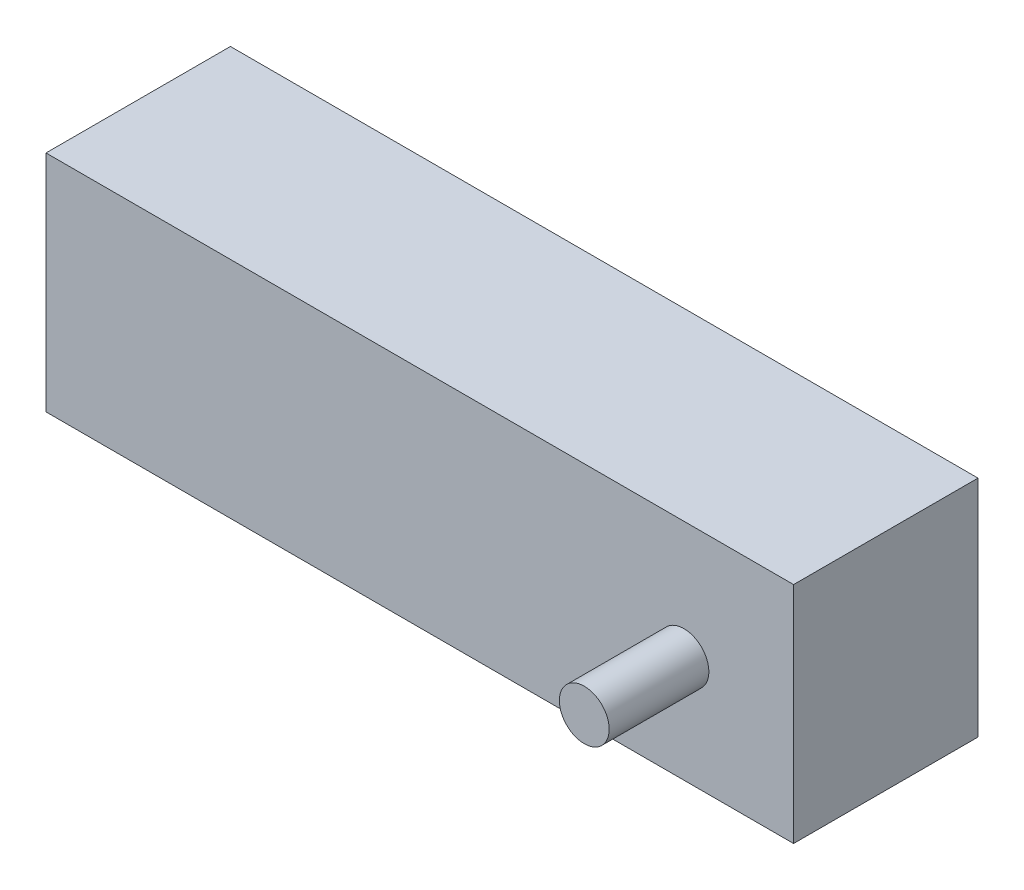
ISO-10303-21;
HEADER;
FILE_DESCRIPTION(('STEP AP214'),'2;1');
FILE_NAME('part.step','',(''),(''),'','','');
FILE_SCHEMA(('AUTOMOTIVE_DESIGN { 1 0 10303 214 1 1 1 1 }'));
ENDSEC;
DATA;
#1=APPLICATION_CONTEXT('core data for automotive mechanical design processes');
#2=APPLICATION_PROTOCOL_DEFINITION('international standard','automotive_design',2000,#1);
#3=PRODUCT_CONTEXT('',#1,'mechanical');
#4=PRODUCT('Part','Part','',(#3));
#5=PRODUCT_RELATED_PRODUCT_CATEGORY('part','',(#4));
#6=PRODUCT_DEFINITION_FORMATION('','',#4);
#7=PRODUCT_DEFINITION_CONTEXT('part definition',#1,'design');
#8=PRODUCT_DEFINITION('design','',#6,#7);
#9=PRODUCT_DEFINITION_SHAPE('','',#8);
#10=(LENGTH_UNIT() NAMED_UNIT(*) SI_UNIT(.MILLI.,.METRE.));
#11=(NAMED_UNIT(*) PLANE_ANGLE_UNIT() SI_UNIT($,.RADIAN.));
#12=(NAMED_UNIT(*) SI_UNIT($,.STERADIAN.) SOLID_ANGLE_UNIT());
#13=UNCERTAINTY_MEASURE_WITH_UNIT(LENGTH_MEASURE(1.E-05),#10,'distance_accuracy_value','');
#14=(GEOMETRIC_REPRESENTATION_CONTEXT(3) GLOBAL_UNCERTAINTY_ASSIGNED_CONTEXT((#13)) GLOBAL_UNIT_ASSIGNED_CONTEXT((#10,
#11,#12)) REPRESENTATION_CONTEXT('',''));
#15=CARTESIAN_POINT('',(0.,0.,0.));
#16=DIRECTION('',(0.,0.,1.));
#17=DIRECTION('',(1.,0.,0.));
#18=AXIS2_PLACEMENT_3D('',#15,#16,#17);
#19=CARTESIAN_POINT('',(2.5,-13.1095041322314,18.5));
#20=DIRECTION('',(1.,0.,0.));
#21=DIRECTION('',(0.,0.,-1.));
#22=AXIS2_PLACEMENT_3D('',#19,#20,#21);
#23=PLANE('',#22);
#24=DIRECTION('',(0.,-1.,0.));
#25=VECTOR('',#24,1.);
#26=CARTESIAN_POINT('',(2.5,-13.1095041322314,0.));
#27=LINE('',#26,#25);
#28=CARTESIAN_POINT('',(2.5,9.39049586776859,0.));
#29=VERTEX_POINT('',#28);
#30=CARTESIAN_POINT('',(2.5,-13.1095041322314,0.));
#31=VERTEX_POINT('',#30);
#32=EDGE_CURVE('E99',#29,#31,#27,.T.);
#33=ORIENTED_EDGE('',*,*,#32,.T.);
#34=DIRECTION('',(0.,0.,-1.));
#35=VECTOR('',#34,1.);
#36=CARTESIAN_POINT('',(2.5,-13.1095041322314,18.5));
#37=LINE('',#36,#35);
#38=CARTESIAN_POINT('',(2.5,-13.1095041322314,18.5));
#39=VERTEX_POINT('',#38);
#40=EDGE_CURVE('E41',#39,#31,#37,.T.);
#41=ORIENTED_EDGE('',*,*,#40,.F.);
#42=DIRECTION('',(0.,-1.,0.));
#43=VECTOR('',#42,1.);
#44=CARTESIAN_POINT('',(2.5,-13.1095041322314,18.5));
#45=LINE('',#44,#43);
#46=CARTESIAN_POINT('',(2.5,9.39049586776859,18.5));
#47=VERTEX_POINT('',#46);
#48=EDGE_CURVE('E85',#47,#39,#45,.T.);
#49=ORIENTED_EDGE('',*,*,#48,.F.);
#50=DIRECTION('',(0.,0.,-1.));
#51=VECTOR('',#50,1.);
#52=CARTESIAN_POINT('',(2.5,9.39049586776859,18.5));
#53=LINE('',#52,#51);
#54=EDGE_CURVE('E95',#47,#29,#53,.T.);
#55=ORIENTED_EDGE('',*,*,#54,.T.);
#56=EDGE_LOOP('',(#33,#41,#49,#55));
#57=FACE_BOUND('',#56,.T.);
#58=ADVANCED_FACE('F33',(#57),#23,.F.);
#59=CARTESIAN_POINT('',(2.5,-13.1095041322314,18.5));
#60=DIRECTION('',(0.,1.,0.));
#61=DIRECTION('',(-1.,0.,0.));
#62=AXIS2_PLACEMENT_3D('',#59,#60,#61);
#63=PLANE('',#62);
#64=DIRECTION('',(1.,0.,0.));
#65=VECTOR('',#64,1.);
#66=CARTESIAN_POINT('',(2.5,-13.1095041322314,0.));
#67=LINE('',#66,#65);
#68=CARTESIAN_POINT('',(77.5,-13.1095041322314,0.));
#69=VERTEX_POINT('',#68);
#70=EDGE_CURVE('E90',#31,#69,#67,.T.);
#71=ORIENTED_EDGE('',*,*,#70,.T.);
#72=DIRECTION('',(0.,0.,-1.));
#73=VECTOR('',#72,1.);
#74=CARTESIAN_POINT('',(77.5,-13.1095041322314,18.5));
#75=LINE('',#74,#73);
#76=CARTESIAN_POINT('',(77.5,-13.1095041322314,18.5));
#77=VERTEX_POINT('',#76);
#78=EDGE_CURVE('E88',#77,#69,#75,.T.);
#79=ORIENTED_EDGE('',*,*,#78,.F.);
#80=DIRECTION('',(1.,0.,0.));
#81=VECTOR('',#80,1.);
#82=CARTESIAN_POINT('',(2.5,-13.1095041322314,18.5));
#83=LINE('',#82,#81);
#84=EDGE_CURVE('E80',#39,#77,#83,.T.);
#85=ORIENTED_EDGE('',*,*,#84,.F.);
#86=ORIENTED_EDGE('',*,*,#40,.T.);
#87=EDGE_LOOP('',(#71,#79,#85,#86));
#88=FACE_BOUND('',#87,.T.);
#89=ADVANCED_FACE('F89',(#88),#63,.F.);
#90=CARTESIAN_POINT('',(77.5,-13.1095041322314,18.5));
#91=DIRECTION('',(-1.,0.,0.));
#92=DIRECTION('',(0.,0.,1.));
#93=AXIS2_PLACEMENT_3D('',#90,#91,#92);
#94=PLANE('',#93);
#95=DIRECTION('',(0.,1.,0.));
#96=VECTOR('',#95,1.);
#97=CARTESIAN_POINT('',(77.5,-13.1095041322314,0.));
#98=LINE('',#97,#96);
#99=CARTESIAN_POINT('',(77.5,9.3904958677686,0.));
#100=VERTEX_POINT('',#99);
#101=EDGE_CURVE('E66',#69,#100,#98,.T.);
#102=ORIENTED_EDGE('',*,*,#101,.T.);
#103=DIRECTION('',(0.,0.,-1.));
#104=VECTOR('',#103,1.);
#105=CARTESIAN_POINT('',(77.5,9.3904958677686,18.5));
#106=LINE('',#105,#104);
#107=CARTESIAN_POINT('',(77.5,9.3904958677686,18.5));
#108=VERTEX_POINT('',#107);
#109=EDGE_CURVE('E91',#108,#100,#106,.T.);
#110=ORIENTED_EDGE('',*,*,#109,.F.);
#111=DIRECTION('',(0.,1.,0.));
#112=VECTOR('',#111,1.);
#113=CARTESIAN_POINT('',(77.5,-13.1095041322314,18.5));
#114=LINE('',#113,#112);
#115=EDGE_CURVE('E83',#77,#108,#114,.T.);
#116=ORIENTED_EDGE('',*,*,#115,.F.);
#117=ORIENTED_EDGE('',*,*,#78,.T.);
#118=EDGE_LOOP('',(#102,#110,#116,#117));
#119=FACE_BOUND('',#118,.T.);
#120=ADVANCED_FACE('F93',(#119),#94,.F.);
#121=CARTESIAN_POINT('',(2.5,9.39049586776859,18.5));
#122=DIRECTION('',(0.,-1.,0.));
#123=DIRECTION('',(1.,0.,0.));
#124=AXIS2_PLACEMENT_3D('',#121,#122,#123);
#125=PLANE('',#124);
#126=DIRECTION('',(-1.,0.,0.));
#127=VECTOR('',#126,1.);
#128=CARTESIAN_POINT('',(2.5,9.39049586776859,0.));
#129=LINE('',#128,#127);
#130=EDGE_CURVE('E72',#100,#29,#129,.T.);
#131=ORIENTED_EDGE('',*,*,#130,.T.);
#132=ORIENTED_EDGE('',*,*,#54,.F.);
#133=DIRECTION('',(-1.,0.,0.));
#134=VECTOR('',#133,1.);
#135=CARTESIAN_POINT('',(2.5,9.39049586776859,18.5));
#136=LINE('',#135,#134);
#137=EDGE_CURVE('E49',#108,#47,#136,.T.);
#138=ORIENTED_EDGE('',*,*,#137,.F.);
#139=ORIENTED_EDGE('',*,*,#109,.T.);
#140=EDGE_LOOP('',(#131,#132,#138,#139));
#141=FACE_BOUND('',#140,.T.);
#142=ADVANCED_FACE('F122',(#141),#125,.F.);
#143=CARTESIAN_POINT('',(0.,0.,18.5));
#144=DIRECTION('',(0.,0.,-1.));
#145=DIRECTION('',(-1.,0.,0.));
#146=AXIS2_PLACEMENT_3D('',#143,#144,#145);
#147=PLANE('',#146);
#148=CARTESIAN_POINT('',(66.5,-2.43727261258631,18.5));
#149=DIRECTION('',(0.,0.,-1.));
#150=DIRECTION('',(-1.,0.,0.));
#151=AXIS2_PLACEMENT_3D('',#148,#149,#150);
#152=CIRCLE('',#151,2.5);
#153=CARTESIAN_POINT('',(64.,-2.43727261258631,18.5));
#154=VERTEX_POINT('',#153);
#155=EDGE_CURVE('E11',#154,#154,#152,.F.);
#156=ORIENTED_EDGE('',*,*,#155,.F.);
#157=EDGE_LOOP('',(#156));
#158=FACE_BOUND('',#157,.T.);
#159=ORIENTED_EDGE('',*,*,#48,.T.);
#160=ORIENTED_EDGE('',*,*,#84,.T.);
#161=ORIENTED_EDGE('',*,*,#115,.T.);
#162=ORIENTED_EDGE('',*,*,#137,.T.);
#163=EDGE_LOOP('',(#159,#160,#161,#162));
#164=FACE_BOUND('',#163,.T.);
#165=ADVANCED_FACE('F81',(#158,#164),#147,.F.);
#166=CARTESIAN_POINT('',(0.,0.,0.));
#167=DIRECTION('',(0.,0.,-1.));
#168=DIRECTION('',(-1.,0.,0.));
#169=AXIS2_PLACEMENT_3D('',#166,#167,#168);
#170=PLANE('',#169);
#171=CARTESIAN_POINT('',(46.,7.39049586776859,0.));
#172=DIRECTION('',(0.,0.,-1.));
#173=DIRECTION('',(-1.,0.,0.));
#174=AXIS2_PLACEMENT_3D('',#171,#172,#173);
#175=CIRCLE('',#174,1.5);
#176=CARTESIAN_POINT('',(44.5,7.39049586776859,0.));
#177=VERTEX_POINT('',#176);
#178=EDGE_CURVE('E211',#177,#177,#175,.T.);
#179=ORIENTED_EDGE('',*,*,#178,.F.);
#180=EDGE_LOOP('',(#179));
#181=FACE_BOUND('',#180,.T.);
#182=CARTESIAN_POINT('',(46.,-11.1095041322314,0.));
#183=DIRECTION('',(0.,0.,-1.));
#184=DIRECTION('',(-1.,0.,0.));
#185=AXIS2_PLACEMENT_3D('',#182,#183,#184);
#186=CIRCLE('',#185,1.5);
#187=CARTESIAN_POINT('',(44.5,-11.1095041322314,0.));
#188=VERTEX_POINT('',#187);
#189=EDGE_CURVE('E221',#188,#188,#186,.T.);
#190=ORIENTED_EDGE('',*,*,#189,.F.);
#191=EDGE_LOOP('',(#190));
#192=FACE_BOUND('',#191,.T.);
#193=ORIENTED_EDGE('',*,*,#32,.F.);
#194=ORIENTED_EDGE('',*,*,#130,.F.);
#195=ORIENTED_EDGE('',*,*,#101,.F.);
#196=ORIENTED_EDGE('',*,*,#70,.F.);
#197=EDGE_LOOP('',(#193,#194,#195,#196));
#198=FACE_BOUND('',#197,.T.);
#199=ADVANCED_FACE('F110',(#181,#192,#198),#170,.T.);
#200=CARTESIAN_POINT('',(66.5,-2.43727261258631,28.5));
#201=DIRECTION('',(0.,0.,-1.));
#202=DIRECTION('',(-1.,0.,0.));
#203=AXIS2_PLACEMENT_3D('',#200,#201,#202);
#204=CYLINDRICAL_SURFACE('',#203,2.5);
#205=CARTESIAN_POINT('',(66.5,-2.43727261258631,28.5));
#206=DIRECTION('',(0.,0.,1.));
#207=DIRECTION('',(1.,0.,0.));
#208=AXIS2_PLACEMENT_3D('',#205,#206,#207);
#209=CIRCLE('',#208,2.5);
#210=CARTESIAN_POINT('',(69.,-2.43727261258631,28.5));
#211=VERTEX_POINT('',#210);
#212=EDGE_CURVE('E102',#211,#211,#209,.T.);
#213=ORIENTED_EDGE('',*,*,#212,.F.);
#214=EDGE_LOOP('',(#213));
#215=FACE_BOUND('',#214,.T.);
#216=ORIENTED_EDGE('',*,*,#155,.T.);
#217=EDGE_LOOP('',(#216));
#218=FACE_BOUND('',#217,.T.);
#219=ADVANCED_FACE('F112',(#215,#218),#204,.T.);
#220=CARTESIAN_POINT('',(66.5,-2.43727261258631,28.5));
#221=DIRECTION('',(0.,0.,1.));
#222=DIRECTION('',(1.,0.,0.));
#223=AXIS2_PLACEMENT_3D('',#220,#221,#222);
#224=PLANE('',#223);
#225=ORIENTED_EDGE('',*,*,#212,.T.);
#226=EDGE_LOOP('',(#225));
#227=FACE_BOUND('',#226,.T.);
#228=ADVANCED_FACE('F119',(#227),#224,.T.);
#229=CARTESIAN_POINT('',(46.,-11.1095041322314,15.));
#230=DIRECTION('',(0.,0.,-1.));
#231=DIRECTION('',(-1.,0.,0.));
#232=AXIS2_PLACEMENT_3D('',#229,#230,#231);
#233=CYLINDRICAL_SURFACE('',#232,1.5);
#234=CARTESIAN_POINT('',(46.,-11.1095041322314,15.));
#235=DIRECTION('',(0.,0.,-1.));
#236=DIRECTION('',(-1.,0.,0.));
#237=AXIS2_PLACEMENT_3D('',#234,#235,#236);
#238=CIRCLE('',#237,1.5);
#239=CARTESIAN_POINT('',(44.5,-11.1095041322314,15.));
#240=VERTEX_POINT('',#239);
#241=EDGE_CURVE('E216',#240,#240,#238,.T.);
#242=ORIENTED_EDGE('',*,*,#241,.F.);
#243=EDGE_LOOP('',(#242));
#244=FACE_BOUND('',#243,.T.);
#245=ORIENTED_EDGE('',*,*,#189,.T.);
#246=EDGE_LOOP('',(#245));
#247=FACE_BOUND('',#246,.T.);
#248=ADVANCED_FACE('F160',(#244,#247),#233,.F.);
#249=CARTESIAN_POINT('',(46.,-11.1095041322314,15.));
#250=DIRECTION('',(0.,0.,-1.));
#251=DIRECTION('',(-1.,0.,0.));
#252=AXIS2_PLACEMENT_3D('',#249,#250,#251);
#253=PLANE('',#252);
#254=ORIENTED_EDGE('',*,*,#241,.T.);
#255=EDGE_LOOP('',(#254));
#256=FACE_BOUND('',#255,.T.);
#257=ADVANCED_FACE('F174',(#256),#253,.T.);
#258=CARTESIAN_POINT('',(46.,7.39049586776859,15.));
#259=DIRECTION('',(0.,0.,-1.));
#260=DIRECTION('',(-1.,0.,0.));
#261=AXIS2_PLACEMENT_3D('',#258,#259,#260);
#262=CYLINDRICAL_SURFACE('',#261,1.5);
#263=CARTESIAN_POINT('',(46.,7.39049586776859,15.));
#264=DIRECTION('',(0.,0.,-1.));
#265=DIRECTION('',(-1.,0.,0.));
#266=AXIS2_PLACEMENT_3D('',#263,#264,#265);
#267=CIRCLE('',#266,1.5);
#268=CARTESIAN_POINT('',(44.5,7.39049586776859,15.));
#269=VERTEX_POINT('',#268);
#270=EDGE_CURVE('E210',#269,#269,#267,.T.);
#271=ORIENTED_EDGE('',*,*,#270,.F.);
#272=EDGE_LOOP('',(#271));
#273=FACE_BOUND('',#272,.T.);
#274=ORIENTED_EDGE('',*,*,#178,.T.);
#275=EDGE_LOOP('',(#274));
#276=FACE_BOUND('',#275,.T.);
#277=ADVANCED_FACE('F184',(#273,#276),#262,.F.);
#278=CARTESIAN_POINT('',(46.,7.39049586776859,15.));
#279=DIRECTION('',(0.,0.,-1.));
#280=DIRECTION('',(-1.,0.,0.));
#281=AXIS2_PLACEMENT_3D('',#278,#279,#280);
#282=PLANE('',#281);
#283=ORIENTED_EDGE('',*,*,#270,.T.);
#284=EDGE_LOOP('',(#283));
#285=FACE_BOUND('',#284,.T.);
#286=ADVANCED_FACE('F194',(#285),#282,.T.);
#287=CLOSED_SHELL('',(#58,#89,#120,#142,#165,#199,#219,#228,#248,#257,#277,#286));
#288=MANIFOLD_SOLID_BREP('B2',#287);
#289=ADVANCED_BREP_SHAPE_REPRESENTATION('',(#18,#288),#14);
#290=SHAPE_DEFINITION_REPRESENTATION(#9,#289);
ENDSEC;
END-ISO-10303-21;
